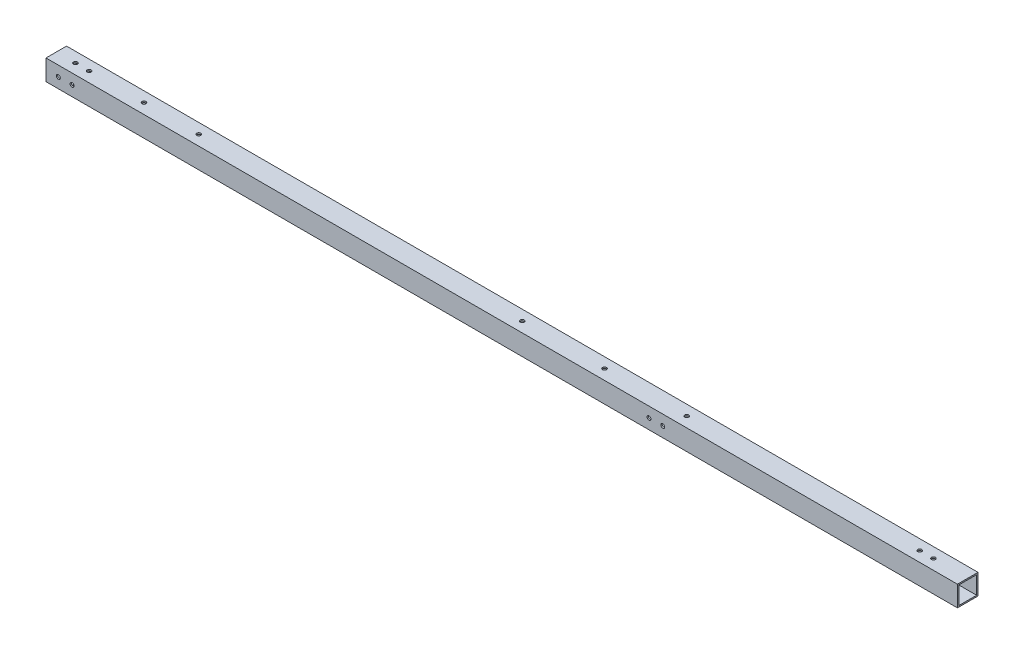
ISO-10303-21;
HEADER;
FILE_DESCRIPTION(('STEP AP214'),'2;1');
FILE_NAME('part.step','',(''),(''),'','','');
FILE_SCHEMA(('AUTOMOTIVE_DESIGN { 1 0 10303 214 1 1 1 1 }'));
ENDSEC;
DATA;
#1=APPLICATION_CONTEXT('core data for automotive mechanical design processes');
#2=APPLICATION_PROTOCOL_DEFINITION('international standard','automotive_design',2000,#1);
#3=PRODUCT_CONTEXT('',#1,'mechanical');
#4=PRODUCT('Part','Part','',(#3));
#5=PRODUCT_RELATED_PRODUCT_CATEGORY('part','',(#4));
#6=PRODUCT_DEFINITION_FORMATION('','',#4);
#7=PRODUCT_DEFINITION_CONTEXT('part definition',#1,'design');
#8=PRODUCT_DEFINITION('design','',#6,#7);
#9=PRODUCT_DEFINITION_SHAPE('','',#8);
#10=(LENGTH_UNIT() NAMED_UNIT(*) SI_UNIT(.MILLI.,.METRE.));
#11=(NAMED_UNIT(*) PLANE_ANGLE_UNIT() SI_UNIT($,.RADIAN.));
#12=(NAMED_UNIT(*) SI_UNIT($,.STERADIAN.) SOLID_ANGLE_UNIT());
#13=UNCERTAINTY_MEASURE_WITH_UNIT(LENGTH_MEASURE(1.E-05),#10,'distance_accuracy_value','');
#14=(GEOMETRIC_REPRESENTATION_CONTEXT(3) GLOBAL_UNCERTAINTY_ASSIGNED_CONTEXT((#13)) GLOBAL_UNIT_ASSIGNED_CONTEXT((#10,
#11,#12)) REPRESENTATION_CONTEXT('',''));
#15=CARTESIAN_POINT('',(0.,0.,0.));
#16=DIRECTION('',(0.,0.,1.));
#17=DIRECTION('',(1.,0.,0.));
#18=AXIS2_PLACEMENT_3D('',#15,#16,#17);
#19=CARTESIAN_POINT('',(665.,0.,0.));
#20=DIRECTION('',(-1.,0.,0.));
#21=DIRECTION('',(0.,0.,1.));
#22=AXIS2_PLACEMENT_3D('',#19,#20,#21);
#23=PLANE('',#22);
#24=DIRECTION('',(0.,1.,0.));
#25=VECTOR('',#24,1.);
#26=CARTESIAN_POINT('',(665.,-7.5,-7.5));
#27=LINE('',#26,#25);
#28=CARTESIAN_POINT('',(665.,-7.5,-7.5));
#29=VERTEX_POINT('',#28);
#30=CARTESIAN_POINT('',(665.,7.5,-7.5));
#31=VERTEX_POINT('',#30);
#32=EDGE_CURVE('E145',#29,#31,#27,.T.);
#33=ORIENTED_EDGE('',*,*,#32,.T.);
#34=DIRECTION('',(0.,0.,1.));
#35=VECTOR('',#34,1.);
#36=CARTESIAN_POINT('',(665.,7.5,7.5));
#37=LINE('',#36,#35);
#38=CARTESIAN_POINT('',(665.,7.5,7.5));
#39=VERTEX_POINT('',#38);
#40=EDGE_CURVE('E148',#31,#39,#37,.T.);
#41=ORIENTED_EDGE('',*,*,#40,.T.);
#42=DIRECTION('',(0.,-1.,0.));
#43=VECTOR('',#42,1.);
#44=CARTESIAN_POINT('',(665.,-7.5,7.5));
#45=LINE('',#44,#43);
#46=CARTESIAN_POINT('',(665.,-7.5,7.5));
#47=VERTEX_POINT('',#46);
#48=EDGE_CURVE('E151',#39,#47,#45,.T.);
#49=ORIENTED_EDGE('',*,*,#48,.T.);
#50=DIRECTION('',(0.,0.,-1.));
#51=VECTOR('',#50,1.);
#52=CARTESIAN_POINT('',(665.,-7.5,7.5));
#53=LINE('',#52,#51);
#54=EDGE_CURVE('E153',#47,#29,#53,.T.);
#55=ORIENTED_EDGE('',*,*,#54,.T.);
#56=EDGE_LOOP('',(#33,#41,#49,#55));
#57=FACE_BOUND('',#56,.T.);
#58=DIRECTION('',(0.,0.,-1.));
#59=VECTOR('',#58,1.);
#60=CARTESIAN_POINT('',(665.,-6.5,6.5));
#61=LINE('',#60,#59);
#62=CARTESIAN_POINT('',(665.,-6.5,6.5));
#63=VERTEX_POINT('',#62);
#64=CARTESIAN_POINT('',(665.,-6.5,-6.5));
#65=VERTEX_POINT('',#64);
#66=EDGE_CURVE('E107',#63,#65,#61,.T.);
#67=ORIENTED_EDGE('',*,*,#66,.F.);
#68=DIRECTION('',(0.,-1.,0.));
#69=VECTOR('',#68,1.);
#70=CARTESIAN_POINT('',(665.,-6.5,6.5));
#71=LINE('',#70,#69);
#72=CARTESIAN_POINT('',(665.,6.5,6.5));
#73=VERTEX_POINT('',#72);
#74=EDGE_CURVE('E129',#73,#63,#71,.T.);
#75=ORIENTED_EDGE('',*,*,#74,.F.);
#76=DIRECTION('',(0.,0.,1.));
#77=VECTOR('',#76,1.);
#78=CARTESIAN_POINT('',(665.,6.5,6.5));
#79=LINE('',#78,#77);
#80=CARTESIAN_POINT('',(665.,6.5,-6.5));
#81=VERTEX_POINT('',#80);
#82=EDGE_CURVE('E127',#81,#73,#79,.T.);
#83=ORIENTED_EDGE('',*,*,#82,.F.);
#84=DIRECTION('',(0.,1.,0.));
#85=VECTOR('',#84,1.);
#86=CARTESIAN_POINT('',(665.,-6.5,-6.5));
#87=LINE('',#86,#85);
#88=EDGE_CURVE('E115',#65,#81,#87,.T.);
#89=ORIENTED_EDGE('',*,*,#88,.F.);
#90=EDGE_LOOP('',(#67,#75,#83,#89));
#91=FACE_BOUND('',#90,.T.);
#92=ADVANCED_FACE('F40',(#57,#91),#23,.F.);
#93=CARTESIAN_POINT('',(0.,0.,0.));
#94=DIRECTION('',(-1.,0.,0.));
#95=DIRECTION('',(0.,0.,1.));
#96=AXIS2_PLACEMENT_3D('',#93,#94,#95);
#97=PLANE('',#96);
#98=DIRECTION('',(0.,1.,0.));
#99=VECTOR('',#98,1.);
#100=CARTESIAN_POINT('',(0.,-7.5,-7.5));
#101=LINE('',#100,#99);
#102=CARTESIAN_POINT('',(0.,-7.5,-7.5));
#103=VERTEX_POINT('',#102);
#104=CARTESIAN_POINT('',(0.,7.5,-7.5));
#105=VERTEX_POINT('',#104);
#106=EDGE_CURVE('E123',#103,#105,#101,.T.);
#107=ORIENTED_EDGE('',*,*,#106,.F.);
#108=DIRECTION('',(0.,0.,-1.));
#109=VECTOR('',#108,1.);
#110=CARTESIAN_POINT('',(0.,-7.5,7.5));
#111=LINE('',#110,#109);
#112=CARTESIAN_POINT('',(0.,-7.5,7.5));
#113=VERTEX_POINT('',#112);
#114=EDGE_CURVE('E149',#113,#103,#111,.T.);
#115=ORIENTED_EDGE('',*,*,#114,.F.);
#116=DIRECTION('',(0.,-1.,0.));
#117=VECTOR('',#116,1.);
#118=CARTESIAN_POINT('',(0.,-7.5,7.5));
#119=LINE('',#118,#117);
#120=CARTESIAN_POINT('',(0.,7.5,7.5));
#121=VERTEX_POINT('',#120);
#122=EDGE_CURVE('E160',#121,#113,#119,.T.);
#123=ORIENTED_EDGE('',*,*,#122,.F.);
#124=DIRECTION('',(0.,0.,1.));
#125=VECTOR('',#124,1.);
#126=CARTESIAN_POINT('',(0.,7.5,7.5));
#127=LINE('',#126,#125);
#128=EDGE_CURVE('E158',#105,#121,#127,.T.);
#129=ORIENTED_EDGE('',*,*,#128,.F.);
#130=EDGE_LOOP('',(#107,#115,#123,#129));
#131=FACE_BOUND('',#130,.T.);
#132=DIRECTION('',(0.,-1.,0.));
#133=VECTOR('',#132,1.);
#134=CARTESIAN_POINT('',(0.,-6.5,6.5));
#135=LINE('',#134,#133);
#136=CARTESIAN_POINT('',(0.,6.5,6.5));
#137=VERTEX_POINT('',#136);
#138=CARTESIAN_POINT('',(0.,-6.5,6.5));
#139=VERTEX_POINT('',#138);
#140=EDGE_CURVE('E116',#137,#139,#135,.T.);
#141=ORIENTED_EDGE('',*,*,#140,.T.);
#142=DIRECTION('',(0.,0.,-1.));
#143=VECTOR('',#142,1.);
#144=CARTESIAN_POINT('',(0.,-6.5,6.5));
#145=LINE('',#144,#143);
#146=CARTESIAN_POINT('',(0.,-6.5,-6.5));
#147=VERTEX_POINT('',#146);
#148=EDGE_CURVE('E65',#139,#147,#145,.T.);
#149=ORIENTED_EDGE('',*,*,#148,.T.);
#150=DIRECTION('',(0.,1.,0.));
#151=VECTOR('',#150,1.);
#152=CARTESIAN_POINT('',(0.,-6.5,-6.5));
#153=LINE('',#152,#151);
#154=CARTESIAN_POINT('',(0.,6.5,-6.5));
#155=VERTEX_POINT('',#154);
#156=EDGE_CURVE('E122',#147,#155,#153,.T.);
#157=ORIENTED_EDGE('',*,*,#156,.T.);
#158=DIRECTION('',(0.,0.,1.));
#159=VECTOR('',#158,1.);
#160=CARTESIAN_POINT('',(0.,6.5,6.5));
#161=LINE('',#160,#159);
#162=EDGE_CURVE('E137',#155,#137,#161,.T.);
#163=ORIENTED_EDGE('',*,*,#162,.T.);
#164=EDGE_LOOP('',(#141,#149,#157,#163));
#165=FACE_BOUND('',#164,.T.);
#166=ADVANCED_FACE('F287',(#131,#165),#97,.T.);
#167=CARTESIAN_POINT('',(665.,-7.5,-7.5));
#168=DIRECTION('',(0.,0.,1.));
#169=DIRECTION('',(1.,0.,0.));
#170=AXIS2_PLACEMENT_3D('',#167,#168,#169);
#171=PLANE('',#170);
#172=CARTESIAN_POINT('',(9.,0.,-7.5));
#173=DIRECTION('',(0.,0.,-1.));
#174=DIRECTION('',(-1.,0.,0.));
#175=AXIS2_PLACEMENT_3D('',#172,#173,#174);
#176=CIRCLE('',#175,1.45);
#177=CARTESIAN_POINT('',(7.55,0.,-7.5));
#178=VERTEX_POINT('',#177);
#179=EDGE_CURVE('E234',#178,#178,#176,.T.);
#180=ORIENTED_EDGE('',*,*,#179,.F.);
#181=EDGE_LOOP('',(#180));
#182=FACE_BOUND('',#181,.T.);
#183=CARTESIAN_POINT('',(19.,0.,-7.5));
#184=DIRECTION('',(0.,0.,-1.));
#185=DIRECTION('',(-1.,0.,0.));
#186=AXIS2_PLACEMENT_3D('',#183,#184,#185);
#187=CIRCLE('',#186,1.45);
#188=CARTESIAN_POINT('',(17.55,0.,-7.5));
#189=VERTEX_POINT('',#188);
#190=EDGE_CURVE('E237',#189,#189,#187,.T.);
#191=ORIENTED_EDGE('',*,*,#190,.F.);
#192=EDGE_LOOP('',(#191));
#193=FACE_BOUND('',#192,.T.);
#194=CARTESIAN_POINT('',(440.000000000001,-4.30211422042248E-13,-7.5));
#195=DIRECTION('',(0.,0.,-1.));
#196=DIRECTION('',(-1.,0.,0.));
#197=AXIS2_PLACEMENT_3D('',#194,#195,#196);
#198=CIRCLE('',#197,1.45);
#199=CARTESIAN_POINT('',(438.550000000001,-4.30211422042248E-13,-7.5));
#200=VERTEX_POINT('',#199);
#201=EDGE_CURVE('E243',#200,#200,#198,.T.);
#202=ORIENTED_EDGE('',*,*,#201,.F.);
#203=EDGE_LOOP('',(#202));
#204=FACE_BOUND('',#203,.T.);
#205=CARTESIAN_POINT('',(450.000000000001,-2.08166817117217E-13,-7.5));
#206=DIRECTION('',(0.,0.,-1.));
#207=DIRECTION('',(-1.,0.,0.));
#208=AXIS2_PLACEMENT_3D('',#205,#206,#207);
#209=CIRCLE('',#208,1.45);
#210=CARTESIAN_POINT('',(448.550000000001,-2.08166817117217E-13,-7.5));
#211=VERTEX_POINT('',#210);
#212=EDGE_CURVE('E249',#211,#211,#209,.T.);
#213=ORIENTED_EDGE('',*,*,#212,.F.);
#214=EDGE_LOOP('',(#213));
#215=FACE_BOUND('',#214,.T.);
#216=ORIENTED_EDGE('',*,*,#106,.T.);
#217=DIRECTION('',(-1.,0.,0.));
#218=VECTOR('',#217,1.);
#219=CARTESIAN_POINT('',(665.,7.5,-7.5));
#220=LINE('',#219,#218);
#221=EDGE_CURVE('E11',#31,#105,#220,.T.);
#222=ORIENTED_EDGE('',*,*,#221,.F.);
#223=ORIENTED_EDGE('',*,*,#32,.F.);
#224=DIRECTION('',(-1.,0.,0.));
#225=VECTOR('',#224,1.);
#226=CARTESIAN_POINT('',(665.,-7.5,-7.5));
#227=LINE('',#226,#225);
#228=EDGE_CURVE('E155',#29,#103,#227,.T.);
#229=ORIENTED_EDGE('',*,*,#228,.T.);
#230=EDGE_LOOP('',(#216,#222,#223,#229));
#231=FACE_BOUND('',#230,.T.);
#232=ADVANCED_FACE('F42',(#182,#193,#204,#215,#231),#171,.F.);
#233=CARTESIAN_POINT('',(665.,7.5,7.5));
#234=DIRECTION('',(0.,-1.,0.));
#235=DIRECTION('',(0.,0.,-1.));
#236=AXIS2_PLACEMENT_3D('',#233,#234,#235);
#237=PLANE('',#236);
#238=CARTESIAN_POINT('',(64.,7.5,0.));
#239=DIRECTION('',(0.,1.,0.));
#240=DIRECTION('',(0.,0.,1.));
#241=AXIS2_PLACEMENT_3D('',#238,#239,#240);
#242=CIRCLE('',#241,1.45);
#243=CARTESIAN_POINT('',(64.,7.5,1.45000000000002));
#244=VERTEX_POINT('',#243);
#245=EDGE_CURVE('E441',#244,#244,#242,.T.);
#246=ORIENTED_EDGE('',*,*,#245,.F.);
#247=EDGE_LOOP('',(#246));
#248=FACE_BOUND('',#247,.T.);
#249=CARTESIAN_POINT('',(24.,7.5,0.));
#250=DIRECTION('',(0.,1.,0.));
#251=DIRECTION('',(0.,0.,1.));
#252=AXIS2_PLACEMENT_3D('',#249,#250,#251);
#253=CIRCLE('',#252,1.45);
#254=CARTESIAN_POINT('',(24.,7.5,1.45000000000002));
#255=VERTEX_POINT('',#254);
#256=EDGE_CURVE('E434',#255,#255,#253,.T.);
#257=ORIENTED_EDGE('',*,*,#256,.F.);
#258=EDGE_LOOP('',(#257));
#259=FACE_BOUND('',#258,.T.);
#260=CARTESIAN_POINT('',(14.,7.5,0.));
#261=DIRECTION('',(0.,1.,0.));
#262=DIRECTION('',(0.,0.,1.));
#263=AXIS2_PLACEMENT_3D('',#260,#261,#262);
#264=CIRCLE('',#263,1.45);
#265=CARTESIAN_POINT('',(14.,7.5,1.45000000000002));
#266=VERTEX_POINT('',#265);
#267=EDGE_CURVE('E453',#266,#266,#264,.T.);
#268=ORIENTED_EDGE('',*,*,#267,.F.);
#269=EDGE_LOOP('',(#268));
#270=FACE_BOUND('',#269,.T.);
#271=CARTESIAN_POINT('',(640.,7.5,0.));
#272=DIRECTION('',(0.,1.,0.));
#273=DIRECTION('',(0.,0.,1.));
#274=AXIS2_PLACEMENT_3D('',#271,#272,#273);
#275=CIRCLE('',#274,1.44999999999994);
#276=CARTESIAN_POINT('',(640.,7.5,1.44999999999996));
#277=VERTEX_POINT('',#276);
#278=EDGE_CURVE('E446',#277,#277,#275,.T.);
#279=ORIENTED_EDGE('',*,*,#278,.F.);
#280=EDGE_LOOP('',(#279));
#281=FACE_BOUND('',#280,.T.);
#282=CARTESIAN_POINT('',(104.,7.5,0.));
#283=DIRECTION('',(0.,1.,0.));
#284=DIRECTION('',(0.,0.,1.));
#285=AXIS2_PLACEMENT_3D('',#282,#283,#284);
#286=CIRCLE('',#285,1.45);
#287=CARTESIAN_POINT('',(104.,7.5,1.45000000000002));
#288=VERTEX_POINT('',#287);
#289=EDGE_CURVE('E410',#288,#288,#286,.T.);
#290=ORIENTED_EDGE('',*,*,#289,.F.);
#291=EDGE_LOOP('',(#290));
#292=FACE_BOUND('',#291,.T.);
#293=CARTESIAN_POINT('',(340.,7.5,9.71445146547012E-13));
#294=DIRECTION('',(0.,1.,0.));
#295=DIRECTION('',(0.,0.,1.));
#296=AXIS2_PLACEMENT_3D('',#293,#294,#295);
#297=CIRCLE('',#296,1.45);
#298=CARTESIAN_POINT('',(340.,7.5,1.45000000000097));
#299=VERTEX_POINT('',#298);
#300=EDGE_CURVE('E411',#299,#299,#297,.T.);
#301=ORIENTED_EDGE('',*,*,#300,.F.);
#302=EDGE_LOOP('',(#301));
#303=FACE_BOUND('',#302,.T.);
#304=CARTESIAN_POINT('',(400.,7.5,9.61036805691151E-13));
#305=DIRECTION('',(0.,1.,0.));
#306=DIRECTION('',(0.,0.,1.));
#307=AXIS2_PLACEMENT_3D('',#304,#305,#306);
#308=CIRCLE('',#307,1.45);
#309=CARTESIAN_POINT('',(400.,7.5,1.45000000000096));
#310=VERTEX_POINT('',#309);
#311=EDGE_CURVE('E422',#310,#310,#308,.T.);
#312=ORIENTED_EDGE('',*,*,#311,.F.);
#313=EDGE_LOOP('',(#312));
#314=FACE_BOUND('',#313,.T.);
#315=CARTESIAN_POINT('',(460.,7.5,9.61036805691151E-13));
#316=DIRECTION('',(0.,1.,0.));
#317=DIRECTION('',(0.,0.,1.));
#318=AXIS2_PLACEMENT_3D('',#315,#316,#317);
#319=CIRCLE('',#318,1.45);
#320=CARTESIAN_POINT('',(460.,7.5,1.45000000000096));
#321=VERTEX_POINT('',#320);
#322=EDGE_CURVE('E428',#321,#321,#319,.T.);
#323=ORIENTED_EDGE('',*,*,#322,.F.);
#324=EDGE_LOOP('',(#323));
#325=FACE_BOUND('',#324,.T.);
#326=CARTESIAN_POINT('',(630.,7.5,0.));
#327=DIRECTION('',(0.,1.,0.));
#328=DIRECTION('',(0.,0.,1.));
#329=AXIS2_PLACEMENT_3D('',#326,#327,#328);
#330=CIRCLE('',#329,1.44999999999994);
#331=CARTESIAN_POINT('',(630.,7.5,1.44999999999996));
#332=VERTEX_POINT('',#331);
#333=EDGE_CURVE('E449',#332,#332,#330,.T.);
#334=ORIENTED_EDGE('',*,*,#333,.F.);
#335=EDGE_LOOP('',(#334));
#336=FACE_BOUND('',#335,.T.);
#337=ORIENTED_EDGE('',*,*,#128,.T.);
#338=DIRECTION('',(-1.,0.,0.));
#339=VECTOR('',#338,1.);
#340=CARTESIAN_POINT('',(665.,7.5,7.5));
#341=LINE('',#340,#339);
#342=EDGE_CURVE('E49',#39,#121,#341,.T.);
#343=ORIENTED_EDGE('',*,*,#342,.F.);
#344=ORIENTED_EDGE('',*,*,#40,.F.);
#345=ORIENTED_EDGE('',*,*,#221,.T.);
#346=EDGE_LOOP('',(#337,#343,#344,#345));
#347=FACE_BOUND('',#346,.T.);
#348=ADVANCED_FACE('F286',(#248,#259,#270,#281,#292,#303,#314,#325,#336,#347),#237,.F.);
#349=CARTESIAN_POINT('',(665.,-7.5,7.5));
#350=DIRECTION('',(0.,0.,-1.));
#351=DIRECTION('',(-1.,0.,0.));
#352=AXIS2_PLACEMENT_3D('',#349,#350,#351);
#353=PLANE('',#352);
#354=CARTESIAN_POINT('',(9.,0.,7.5));
#355=DIRECTION('',(0.,0.,-1.));
#356=DIRECTION('',(-1.,0.,0.));
#357=AXIS2_PLACEMENT_3D('',#354,#355,#356);
#358=CIRCLE('',#357,1.45);
#359=CARTESIAN_POINT('',(7.55,0.,7.5));
#360=VERTEX_POINT('',#359);
#361=EDGE_CURVE('E174',#360,#360,#358,.T.);
#362=ORIENTED_EDGE('',*,*,#361,.T.);
#363=EDGE_LOOP('',(#362));
#364=FACE_BOUND('',#363,.T.);
#365=CARTESIAN_POINT('',(19.,0.,7.5));
#366=DIRECTION('',(0.,0.,-1.));
#367=DIRECTION('',(-1.,0.,0.));
#368=AXIS2_PLACEMENT_3D('',#365,#366,#367);
#369=CIRCLE('',#368,1.45);
#370=CARTESIAN_POINT('',(17.55,0.,7.5));
#371=VERTEX_POINT('',#370);
#372=EDGE_CURVE('E240',#371,#371,#369,.T.);
#373=ORIENTED_EDGE('',*,*,#372,.T.);
#374=EDGE_LOOP('',(#373));
#375=FACE_BOUND('',#374,.T.);
#376=CARTESIAN_POINT('',(440.000000000001,-4.30211422042248E-13,7.5));
#377=DIRECTION('',(0.,0.,-1.));
#378=DIRECTION('',(-1.,0.,0.));
#379=AXIS2_PLACEMENT_3D('',#376,#377,#378);
#380=CIRCLE('',#379,1.45);
#381=CARTESIAN_POINT('',(438.550000000001,-4.30211422042248E-13,7.5));
#382=VERTEX_POINT('',#381);
#383=EDGE_CURVE('E246',#382,#382,#380,.T.);
#384=ORIENTED_EDGE('',*,*,#383,.T.);
#385=EDGE_LOOP('',(#384));
#386=FACE_BOUND('',#385,.T.);
#387=CARTESIAN_POINT('',(450.000000000001,-2.08166817117217E-13,7.5));
#388=DIRECTION('',(0.,0.,-1.));
#389=DIRECTION('',(-1.,0.,0.));
#390=AXIS2_PLACEMENT_3D('',#387,#388,#389);
#391=CIRCLE('',#390,1.45);
#392=CARTESIAN_POINT('',(448.550000000001,-2.08166817117217E-13,7.5));
#393=VERTEX_POINT('',#392);
#394=EDGE_CURVE('E231',#393,#393,#391,.T.);
#395=ORIENTED_EDGE('',*,*,#394,.T.);
#396=EDGE_LOOP('',(#395));
#397=FACE_BOUND('',#396,.T.);
#398=ORIENTED_EDGE('',*,*,#122,.T.);
#399=DIRECTION('',(-1.,0.,0.));
#400=VECTOR('',#399,1.);
#401=CARTESIAN_POINT('',(665.,-7.5,7.5));
#402=LINE('',#401,#400);
#403=EDGE_CURVE('E165',#47,#113,#402,.T.);
#404=ORIENTED_EDGE('',*,*,#403,.F.);
#405=ORIENTED_EDGE('',*,*,#48,.F.);
#406=ORIENTED_EDGE('',*,*,#342,.T.);
#407=EDGE_LOOP('',(#398,#404,#405,#406));
#408=FACE_BOUND('',#407,.T.);
#409=ADVANCED_FACE('F306',(#364,#375,#386,#397,#408),#353,.F.);
#410=CARTESIAN_POINT('',(665.,-7.5,7.5));
#411=DIRECTION('',(0.,1.,0.));
#412=DIRECTION('',(0.,0.,1.));
#413=AXIS2_PLACEMENT_3D('',#410,#411,#412);
#414=PLANE('',#413);
#415=CARTESIAN_POINT('',(64.,-7.5,0.));
#416=DIRECTION('',(0.,1.,0.));
#417=DIRECTION('',(0.,0.,1.));
#418=AXIS2_PLACEMENT_3D('',#415,#416,#417);
#419=CIRCLE('',#418,1.45);
#420=CARTESIAN_POINT('',(64.,-7.5,1.45000000000002));
#421=VERTEX_POINT('',#420);
#422=EDGE_CURVE('E414',#421,#421,#419,.T.);
#423=ORIENTED_EDGE('',*,*,#422,.T.);
#424=EDGE_LOOP('',(#423));
#425=FACE_BOUND('',#424,.T.);
#426=CARTESIAN_POINT('',(24.,-7.5,0.));
#427=DIRECTION('',(0.,1.,0.));
#428=DIRECTION('',(0.,0.,1.));
#429=AXIS2_PLACEMENT_3D('',#426,#427,#428);
#430=CIRCLE('',#429,1.45);
#431=CARTESIAN_POINT('',(24.,-7.5,1.45000000000002));
#432=VERTEX_POINT('',#431);
#433=EDGE_CURVE('E438',#432,#432,#430,.T.);
#434=ORIENTED_EDGE('',*,*,#433,.T.);
#435=EDGE_LOOP('',(#434));
#436=FACE_BOUND('',#435,.T.);
#437=CARTESIAN_POINT('',(14.,-7.5,0.));
#438=DIRECTION('',(0.,1.,0.));
#439=DIRECTION('',(0.,0.,1.));
#440=AXIS2_PLACEMENT_3D('',#437,#438,#439);
#441=CIRCLE('',#440,1.45);
#442=CARTESIAN_POINT('',(14.,-7.5,1.45000000000002));
#443=VERTEX_POINT('',#442);
#444=EDGE_CURVE('E437',#443,#443,#441,.T.);
#445=ORIENTED_EDGE('',*,*,#444,.T.);
#446=EDGE_LOOP('',(#445));
#447=FACE_BOUND('',#446,.T.);
#448=CARTESIAN_POINT('',(640.,-7.5,0.));
#449=DIRECTION('',(0.,1.,0.));
#450=DIRECTION('',(0.,0.,1.));
#451=AXIS2_PLACEMENT_3D('',#448,#449,#450);
#452=CIRCLE('',#451,1.44999999999994);
#453=CARTESIAN_POINT('',(640.,-7.5,1.44999999999996));
#454=VERTEX_POINT('',#453);
#455=EDGE_CURVE('E450',#454,#454,#452,.T.);
#456=ORIENTED_EDGE('',*,*,#455,.T.);
#457=EDGE_LOOP('',(#456));
#458=FACE_BOUND('',#457,.T.);
#459=CARTESIAN_POINT('',(104.,-7.5,0.));
#460=DIRECTION('',(0.,1.,0.));
#461=DIRECTION('',(0.,0.,1.));
#462=AXIS2_PLACEMENT_3D('',#459,#460,#461);
#463=CIRCLE('',#462,1.45);
#464=CARTESIAN_POINT('',(104.,-7.5,1.45000000000002));
#465=VERTEX_POINT('',#464);
#466=EDGE_CURVE('E408',#465,#465,#463,.T.);
#467=ORIENTED_EDGE('',*,*,#466,.T.);
#468=EDGE_LOOP('',(#467));
#469=FACE_BOUND('',#468,.T.);
#470=CARTESIAN_POINT('',(340.,-7.5,9.71445146547012E-13));
#471=DIRECTION('',(0.,1.,0.));
#472=DIRECTION('',(0.,0.,1.));
#473=AXIS2_PLACEMENT_3D('',#470,#471,#472);
#474=CIRCLE('',#473,1.45);
#475=CARTESIAN_POINT('',(340.,-7.5,1.45000000000097));
#476=VERTEX_POINT('',#475);
#477=EDGE_CURVE('E417',#476,#476,#474,.T.);
#478=ORIENTED_EDGE('',*,*,#477,.T.);
#479=EDGE_LOOP('',(#478));
#480=FACE_BOUND('',#479,.T.);
#481=CARTESIAN_POINT('',(400.,-7.5,9.61036805691151E-13));
#482=DIRECTION('',(0.,1.,0.));
#483=DIRECTION('',(0.,0.,1.));
#484=AXIS2_PLACEMENT_3D('',#481,#482,#483);
#485=CIRCLE('',#484,1.45);
#486=CARTESIAN_POINT('',(400.,-7.5,1.45000000000096));
#487=VERTEX_POINT('',#486);
#488=EDGE_CURVE('E425',#487,#487,#485,.T.);
#489=ORIENTED_EDGE('',*,*,#488,.T.);
#490=EDGE_LOOP('',(#489));
#491=FACE_BOUND('',#490,.T.);
#492=CARTESIAN_POINT('',(460.,-7.5,9.61036805691151E-13));
#493=DIRECTION('',(0.,1.,0.));
#494=DIRECTION('',(0.,0.,1.));
#495=AXIS2_PLACEMENT_3D('',#492,#493,#494);
#496=CIRCLE('',#495,1.45);
#497=CARTESIAN_POINT('',(460.,-7.5,1.45000000000096));
#498=VERTEX_POINT('',#497);
#499=EDGE_CURVE('E431',#498,#498,#496,.T.);
#500=ORIENTED_EDGE('',*,*,#499,.T.);
#501=EDGE_LOOP('',(#500));
#502=FACE_BOUND('',#501,.T.);
#503=CARTESIAN_POINT('',(630.,-7.5,0.));
#504=DIRECTION('',(0.,1.,0.));
#505=DIRECTION('',(0.,0.,1.));
#506=AXIS2_PLACEMENT_3D('',#503,#504,#505);
#507=CIRCLE('',#506,1.44999999999994);
#508=CARTESIAN_POINT('',(630.,-7.5,1.44999999999996));
#509=VERTEX_POINT('',#508);
#510=EDGE_CURVE('E190',#509,#509,#507,.T.);
#511=ORIENTED_EDGE('',*,*,#510,.T.);
#512=EDGE_LOOP('',(#511));
#513=FACE_BOUND('',#512,.T.);
#514=ORIENTED_EDGE('',*,*,#114,.T.);
#515=ORIENTED_EDGE('',*,*,#228,.F.);
#516=ORIENTED_EDGE('',*,*,#54,.F.);
#517=ORIENTED_EDGE('',*,*,#403,.T.);
#518=EDGE_LOOP('',(#514,#515,#516,#517));
#519=FACE_BOUND('',#518,.T.);
#520=ADVANCED_FACE('F304',(#425,#436,#447,#458,#469,#480,#491,#502,#513,#519),#414,.F.);
#521=CARTESIAN_POINT('',(665.,-6.5,6.5));
#522=DIRECTION('',(0.,1.,0.));
#523=DIRECTION('',(0.,0.,1.));
#524=AXIS2_PLACEMENT_3D('',#521,#522,#523);
#525=PLANE('',#524);
#526=CARTESIAN_POINT('',(64.,-6.5,0.));
#527=DIRECTION('',(0.,1.,0.));
#528=DIRECTION('',(0.,0.,1.));
#529=AXIS2_PLACEMENT_3D('',#526,#527,#528);
#530=CIRCLE('',#529,1.45);
#531=CARTESIAN_POINT('',(64.,-6.5,1.45000000000002));
#532=VERTEX_POINT('',#531);
#533=EDGE_CURVE('E228',#532,#532,#530,.T.);
#534=ORIENTED_EDGE('',*,*,#533,.F.);
#535=EDGE_LOOP('',(#534));
#536=FACE_BOUND('',#535,.T.);
#537=CARTESIAN_POINT('',(24.,-6.5,0.));
#538=DIRECTION('',(0.,1.,0.));
#539=DIRECTION('',(0.,0.,1.));
#540=AXIS2_PLACEMENT_3D('',#537,#538,#539);
#541=CIRCLE('',#540,1.45);
#542=CARTESIAN_POINT('',(24.,-6.5,1.45000000000002));
#543=VERTEX_POINT('',#542);
#544=EDGE_CURVE('E216',#543,#543,#541,.T.);
#545=ORIENTED_EDGE('',*,*,#544,.F.);
#546=EDGE_LOOP('',(#545));
#547=FACE_BOUND('',#546,.T.);
#548=CARTESIAN_POINT('',(14.,-6.5,0.));
#549=DIRECTION('',(0.,1.,0.));
#550=DIRECTION('',(0.,0.,1.));
#551=AXIS2_PLACEMENT_3D('',#548,#549,#550);
#552=CIRCLE('',#551,1.45);
#553=CARTESIAN_POINT('',(14.,-6.5,1.45000000000002));
#554=VERTEX_POINT('',#553);
#555=EDGE_CURVE('E213',#554,#554,#552,.T.);
#556=ORIENTED_EDGE('',*,*,#555,.F.);
#557=EDGE_LOOP('',(#556));
#558=FACE_BOUND('',#557,.T.);
#559=CARTESIAN_POINT('',(640.,-6.5,0.));
#560=DIRECTION('',(0.,1.,0.));
#561=DIRECTION('',(0.,0.,1.));
#562=AXIS2_PLACEMENT_3D('',#559,#560,#561);
#563=CIRCLE('',#562,1.44999999999994);
#564=CARTESIAN_POINT('',(640.,-6.5,1.44999999999996));
#565=VERTEX_POINT('',#564);
#566=EDGE_CURVE('E210',#565,#565,#563,.T.);
#567=ORIENTED_EDGE('',*,*,#566,.F.);
#568=EDGE_LOOP('',(#567));
#569=FACE_BOUND('',#568,.T.);
#570=CARTESIAN_POINT('',(104.,-6.5,0.));
#571=DIRECTION('',(0.,1.,0.));
#572=DIRECTION('',(0.,0.,1.));
#573=AXIS2_PLACEMENT_3D('',#570,#571,#572);
#574=CIRCLE('',#573,1.45);
#575=CARTESIAN_POINT('',(104.,-6.5,1.45000000000002));
#576=VERTEX_POINT('',#575);
#577=EDGE_CURVE('E206',#576,#576,#574,.T.);
#578=ORIENTED_EDGE('',*,*,#577,.F.);
#579=EDGE_LOOP('',(#578));
#580=FACE_BOUND('',#579,.T.);
#581=CARTESIAN_POINT('',(340.,-6.5,9.71445146547012E-13));
#582=DIRECTION('',(0.,1.,0.));
#583=DIRECTION('',(0.,0.,1.));
#584=AXIS2_PLACEMENT_3D('',#581,#582,#583);
#585=CIRCLE('',#584,1.45);
#586=CARTESIAN_POINT('',(340.,-6.5,1.45000000000097));
#587=VERTEX_POINT('',#586);
#588=EDGE_CURVE('E202',#587,#587,#585,.T.);
#589=ORIENTED_EDGE('',*,*,#588,.F.);
#590=EDGE_LOOP('',(#589));
#591=FACE_BOUND('',#590,.T.);
#592=CARTESIAN_POINT('',(400.,-6.5,9.61036805691151E-13));
#593=DIRECTION('',(0.,1.,0.));
#594=DIRECTION('',(0.,0.,1.));
#595=AXIS2_PLACEMENT_3D('',#592,#593,#594);
#596=CIRCLE('',#595,1.45);
#597=CARTESIAN_POINT('',(400.,-6.5,1.45000000000096));
#598=VERTEX_POINT('',#597);
#599=EDGE_CURVE('E198',#598,#598,#596,.T.);
#600=ORIENTED_EDGE('',*,*,#599,.F.);
#601=EDGE_LOOP('',(#600));
#602=FACE_BOUND('',#601,.T.);
#603=CARTESIAN_POINT('',(460.,-6.5,9.61036805691151E-13));
#604=DIRECTION('',(0.,1.,0.));
#605=DIRECTION('',(0.,0.,1.));
#606=AXIS2_PLACEMENT_3D('',#603,#604,#605);
#607=CIRCLE('',#606,1.45);
#608=CARTESIAN_POINT('',(460.,-6.5,1.45000000000096));
#609=VERTEX_POINT('',#608);
#610=EDGE_CURVE('E194',#609,#609,#607,.T.);
#611=ORIENTED_EDGE('',*,*,#610,.F.);
#612=EDGE_LOOP('',(#611));
#613=FACE_BOUND('',#612,.T.);
#614=CARTESIAN_POINT('',(630.,-6.5,0.));
#615=DIRECTION('',(0.,1.,0.));
#616=DIRECTION('',(0.,0.,1.));
#617=AXIS2_PLACEMENT_3D('',#614,#615,#616);
#618=CIRCLE('',#617,1.44999999999994);
#619=CARTESIAN_POINT('',(630.,-6.5,1.44999999999996));
#620=VERTEX_POINT('',#619);
#621=EDGE_CURVE('E189',#620,#620,#618,.T.);
#622=ORIENTED_EDGE('',*,*,#621,.F.);
#623=EDGE_LOOP('',(#622));
#624=FACE_BOUND('',#623,.T.);
#625=ORIENTED_EDGE('',*,*,#148,.F.);
#626=DIRECTION('',(-1.,0.,0.));
#627=VECTOR('',#626,1.);
#628=CARTESIAN_POINT('',(665.,-6.5,6.5));
#629=LINE('',#628,#627);
#630=EDGE_CURVE('E111',#63,#139,#629,.T.);
#631=ORIENTED_EDGE('',*,*,#630,.F.);
#632=ORIENTED_EDGE('',*,*,#66,.T.);
#633=DIRECTION('',(-1.,0.,0.));
#634=VECTOR('',#633,1.);
#635=CARTESIAN_POINT('',(665.,-6.5,-6.5));
#636=LINE('',#635,#634);
#637=EDGE_CURVE('E110',#65,#147,#636,.T.);
#638=ORIENTED_EDGE('',*,*,#637,.T.);
#639=EDGE_LOOP('',(#625,#631,#632,#638));
#640=FACE_BOUND('',#639,.T.);
#641=ADVANCED_FACE('F109',(#536,#547,#558,#569,#580,#591,#602,#613,#624,#640),#525,.T.);
#642=CARTESIAN_POINT('',(665.,-6.5,-6.5));
#643=DIRECTION('',(0.,0.,1.));
#644=DIRECTION('',(0.,-1.,0.));
#645=AXIS2_PLACEMENT_3D('',#642,#643,#644);
#646=PLANE('',#645);
#647=CARTESIAN_POINT('',(9.,0.,-6.5));
#648=DIRECTION('',(0.,0.,1.));
#649=DIRECTION('',(0.,-1.,0.));
#650=AXIS2_PLACEMENT_3D('',#647,#648,#649);
#651=CIRCLE('',#650,1.45);
#652=CARTESIAN_POINT('',(9.,-1.45,-6.5));
#653=VERTEX_POINT('',#652);
#654=EDGE_CURVE('E135',#653,#653,#651,.T.);
#655=ORIENTED_EDGE('',*,*,#654,.F.);
#656=EDGE_LOOP('',(#655));
#657=FACE_BOUND('',#656,.T.);
#658=CARTESIAN_POINT('',(19.,0.,-6.5));
#659=DIRECTION('',(0.,0.,1.));
#660=DIRECTION('',(0.,-1.,0.));
#661=AXIS2_PLACEMENT_3D('',#658,#659,#660);
#662=CIRCLE('',#661,1.45);
#663=CARTESIAN_POINT('',(19.,-1.44999999999999,-6.5));
#664=VERTEX_POINT('',#663);
#665=EDGE_CURVE('E182',#664,#664,#662,.T.);
#666=ORIENTED_EDGE('',*,*,#665,.F.);
#667=EDGE_LOOP('',(#666));
#668=FACE_BOUND('',#667,.T.);
#669=CARTESIAN_POINT('',(440.000000000001,-4.30211422042248E-13,-6.5));
#670=DIRECTION('',(0.,0.,1.));
#671=DIRECTION('',(0.,-1.,0.));
#672=AXIS2_PLACEMENT_3D('',#669,#670,#671);
#673=CIRCLE('',#672,1.45);
#674=CARTESIAN_POINT('',(440.000000000001,-1.45000000000043,-6.5));
#675=VERTEX_POINT('',#674);
#676=EDGE_CURVE('E178',#675,#675,#673,.T.);
#677=ORIENTED_EDGE('',*,*,#676,.F.);
#678=EDGE_LOOP('',(#677));
#679=FACE_BOUND('',#678,.T.);
#680=CARTESIAN_POINT('',(450.000000000001,-2.08166817117217E-13,-6.5));
#681=DIRECTION('',(0.,0.,1.));
#682=DIRECTION('',(0.,-1.,0.));
#683=AXIS2_PLACEMENT_3D('',#680,#681,#682);
#684=CIRCLE('',#683,1.45);
#685=CARTESIAN_POINT('',(450.000000000001,-1.45000000000021,-6.5));
#686=VERTEX_POINT('',#685);
#687=EDGE_CURVE('E173',#686,#686,#684,.T.);
#688=ORIENTED_EDGE('',*,*,#687,.F.);
#689=EDGE_LOOP('',(#688));
#690=FACE_BOUND('',#689,.T.);
#691=ORIENTED_EDGE('',*,*,#156,.F.);
#692=ORIENTED_EDGE('',*,*,#637,.F.);
#693=ORIENTED_EDGE('',*,*,#88,.T.);
#694=DIRECTION('',(-1.,0.,0.));
#695=VECTOR('',#694,1.);
#696=CARTESIAN_POINT('',(665.,6.5,-6.5));
#697=LINE('',#696,#695);
#698=EDGE_CURVE('E124',#81,#155,#697,.T.);
#699=ORIENTED_EDGE('',*,*,#698,.T.);
#700=EDGE_LOOP('',(#691,#692,#693,#699));
#701=FACE_BOUND('',#700,.T.);
#702=ADVANCED_FACE('F119',(#657,#668,#679,#690,#701),#646,.T.);
#703=CARTESIAN_POINT('',(665.,6.5,6.5));
#704=DIRECTION('',(0.,-1.,0.));
#705=DIRECTION('',(0.,0.,-1.));
#706=AXIS2_PLACEMENT_3D('',#703,#704,#705);
#707=PLANE('',#706);
#708=CARTESIAN_POINT('',(64.,6.5,0.));
#709=DIRECTION('',(0.,-1.,0.));
#710=DIRECTION('',(0.,0.,-1.));
#711=AXIS2_PLACEMENT_3D('',#708,#709,#710);
#712=CIRCLE('',#711,1.45);
#713=CARTESIAN_POINT('',(64.,6.5,-1.44999999999998));
#714=VERTEX_POINT('',#713);
#715=EDGE_CURVE('E44',#714,#714,#712,.T.);
#716=ORIENTED_EDGE('',*,*,#715,.F.);
#717=EDGE_LOOP('',(#716));
#718=FACE_BOUND('',#717,.T.);
#719=CARTESIAN_POINT('',(24.,6.5,0.));
#720=DIRECTION('',(0.,-1.,0.));
#721=DIRECTION('',(0.,0.,-1.));
#722=AXIS2_PLACEMENT_3D('',#719,#720,#721);
#723=CIRCLE('',#722,1.45);
#724=CARTESIAN_POINT('',(24.,6.5,-1.44999999999998));
#725=VERTEX_POINT('',#724);
#726=EDGE_CURVE('E214',#725,#725,#723,.T.);
#727=ORIENTED_EDGE('',*,*,#726,.F.);
#728=EDGE_LOOP('',(#727));
#729=FACE_BOUND('',#728,.T.);
#730=CARTESIAN_POINT('',(14.,6.5,0.));
#731=DIRECTION('',(0.,-1.,0.));
#732=DIRECTION('',(0.,0.,-1.));
#733=AXIS2_PLACEMENT_3D('',#730,#731,#732);
#734=CIRCLE('',#733,1.45);
#735=CARTESIAN_POINT('',(14.,6.5,-1.44999999999998));
#736=VERTEX_POINT('',#735);
#737=EDGE_CURVE('E211',#736,#736,#734,.T.);
#738=ORIENTED_EDGE('',*,*,#737,.F.);
#739=EDGE_LOOP('',(#738));
#740=FACE_BOUND('',#739,.T.);
#741=CARTESIAN_POINT('',(640.,6.5,0.));
#742=DIRECTION('',(0.,-1.,0.));
#743=DIRECTION('',(0.,0.,-1.));
#744=AXIS2_PLACEMENT_3D('',#741,#742,#743);
#745=CIRCLE('',#744,1.44999999999994);
#746=CARTESIAN_POINT('',(640.,6.5,-1.44999999999992));
#747=VERTEX_POINT('',#746);
#748=EDGE_CURVE('E207',#747,#747,#745,.T.);
#749=ORIENTED_EDGE('',*,*,#748,.F.);
#750=EDGE_LOOP('',(#749));
#751=FACE_BOUND('',#750,.T.);
#752=CARTESIAN_POINT('',(104.,6.5,0.));
#753=DIRECTION('',(0.,-1.,0.));
#754=DIRECTION('',(0.,0.,-1.));
#755=AXIS2_PLACEMENT_3D('',#752,#753,#754);
#756=CIRCLE('',#755,1.45);
#757=CARTESIAN_POINT('',(104.,6.5,-1.44999999999998));
#758=VERTEX_POINT('',#757);
#759=EDGE_CURVE('E203',#758,#758,#756,.T.);
#760=ORIENTED_EDGE('',*,*,#759,.F.);
#761=EDGE_LOOP('',(#760));
#762=FACE_BOUND('',#761,.T.);
#763=CARTESIAN_POINT('',(340.,6.5,9.71445146547012E-13));
#764=DIRECTION('',(0.,-1.,0.));
#765=DIRECTION('',(0.,0.,-1.));
#766=AXIS2_PLACEMENT_3D('',#763,#764,#765);
#767=CIRCLE('',#766,1.45);
#768=CARTESIAN_POINT('',(340.,6.5,-1.44999999999903));
#769=VERTEX_POINT('',#768);
#770=EDGE_CURVE('E199',#769,#769,#767,.T.);
#771=ORIENTED_EDGE('',*,*,#770,.F.);
#772=EDGE_LOOP('',(#771));
#773=FACE_BOUND('',#772,.T.);
#774=CARTESIAN_POINT('',(400.,6.5,9.61036805691151E-13));
#775=DIRECTION('',(0.,-1.,0.));
#776=DIRECTION('',(0.,0.,-1.));
#777=AXIS2_PLACEMENT_3D('',#774,#775,#776);
#778=CIRCLE('',#777,1.45);
#779=CARTESIAN_POINT('',(400.,6.5,-1.44999999999904));
#780=VERTEX_POINT('',#779);
#781=EDGE_CURVE('E195',#780,#780,#778,.T.);
#782=ORIENTED_EDGE('',*,*,#781,.F.);
#783=EDGE_LOOP('',(#782));
#784=FACE_BOUND('',#783,.T.);
#785=CARTESIAN_POINT('',(460.,6.5,9.61036805691151E-13));
#786=DIRECTION('',(0.,-1.,0.));
#787=DIRECTION('',(0.,0.,-1.));
#788=AXIS2_PLACEMENT_3D('',#785,#786,#787);
#789=CIRCLE('',#788,1.45);
#790=CARTESIAN_POINT('',(460.,6.5,-1.44999999999904));
#791=VERTEX_POINT('',#790);
#792=EDGE_CURVE('E191',#791,#791,#789,.T.);
#793=ORIENTED_EDGE('',*,*,#792,.F.);
#794=EDGE_LOOP('',(#793));
#795=FACE_BOUND('',#794,.T.);
#796=CARTESIAN_POINT('',(630.,6.5,0.));
#797=DIRECTION('',(0.,-1.,0.));
#798=DIRECTION('',(0.,0.,-1.));
#799=AXIS2_PLACEMENT_3D('',#796,#797,#798);
#800=CIRCLE('',#799,1.44999999999994);
#801=CARTESIAN_POINT('',(630.,6.5,-1.44999999999993));
#802=VERTEX_POINT('',#801);
#803=EDGE_CURVE('E186',#802,#802,#800,.T.);
#804=ORIENTED_EDGE('',*,*,#803,.F.);
#805=EDGE_LOOP('',(#804));
#806=FACE_BOUND('',#805,.T.);
#807=ORIENTED_EDGE('',*,*,#162,.F.);
#808=ORIENTED_EDGE('',*,*,#698,.F.);
#809=ORIENTED_EDGE('',*,*,#82,.T.);
#810=DIRECTION('',(-1.,0.,0.));
#811=VECTOR('',#810,1.);
#812=CARTESIAN_POINT('',(665.,6.5,6.5));
#813=LINE('',#812,#811);
#814=EDGE_CURVE('E57',#73,#137,#813,.T.);
#815=ORIENTED_EDGE('',*,*,#814,.T.);
#816=EDGE_LOOP('',(#807,#808,#809,#815));
#817=FACE_BOUND('',#816,.T.);
#818=ADVANCED_FACE('F267',(#718,#729,#740,#751,#762,#773,#784,#795,#806,#817),#707,.T.);
#819=CARTESIAN_POINT('',(665.,-6.5,6.5));
#820=DIRECTION('',(0.,0.,-1.));
#821=DIRECTION('',(-1.,0.,0.));
#822=AXIS2_PLACEMENT_3D('',#819,#820,#821);
#823=PLANE('',#822);
#824=CARTESIAN_POINT('',(9.,0.,6.5));
#825=DIRECTION('',(0.,0.,-1.));
#826=DIRECTION('',(-1.,0.,0.));
#827=AXIS2_PLACEMENT_3D('',#824,#825,#826);
#828=CIRCLE('',#827,1.45);
#829=CARTESIAN_POINT('',(7.55,0.,6.5));
#830=VERTEX_POINT('',#829);
#831=EDGE_CURVE('E183',#830,#830,#828,.T.);
#832=ORIENTED_EDGE('',*,*,#831,.F.);
#833=EDGE_LOOP('',(#832));
#834=FACE_BOUND('',#833,.T.);
#835=CARTESIAN_POINT('',(19.,0.,6.5));
#836=DIRECTION('',(0.,0.,-1.));
#837=DIRECTION('',(-1.,0.,0.));
#838=AXIS2_PLACEMENT_3D('',#835,#836,#837);
#839=CIRCLE('',#838,1.45);
#840=CARTESIAN_POINT('',(17.55,0.,6.5));
#841=VERTEX_POINT('',#840);
#842=EDGE_CURVE('E179',#841,#841,#839,.T.);
#843=ORIENTED_EDGE('',*,*,#842,.F.);
#844=EDGE_LOOP('',(#843));
#845=FACE_BOUND('',#844,.T.);
#846=CARTESIAN_POINT('',(440.000000000001,-4.30211422042248E-13,6.5));
#847=DIRECTION('',(0.,0.,-1.));
#848=DIRECTION('',(-1.,0.,0.));
#849=AXIS2_PLACEMENT_3D('',#846,#847,#848);
#850=CIRCLE('',#849,1.45);
#851=CARTESIAN_POINT('',(438.550000000001,-4.30211422042248E-13,6.5));
#852=VERTEX_POINT('',#851);
#853=EDGE_CURVE('E175',#852,#852,#850,.T.);
#854=ORIENTED_EDGE('',*,*,#853,.F.);
#855=EDGE_LOOP('',(#854));
#856=FACE_BOUND('',#855,.T.);
#857=CARTESIAN_POINT('',(450.000000000001,-2.08166817117217E-13,6.5));
#858=DIRECTION('',(0.,0.,-1.));
#859=DIRECTION('',(-1.,0.,0.));
#860=AXIS2_PLACEMENT_3D('',#857,#858,#859);
#861=CIRCLE('',#860,1.45);
#862=CARTESIAN_POINT('',(448.550000000001,-2.08166817117217E-13,6.5));
#863=VERTEX_POINT('',#862);
#864=EDGE_CURVE('E170',#863,#863,#861,.T.);
#865=ORIENTED_EDGE('',*,*,#864,.F.);
#866=EDGE_LOOP('',(#865));
#867=FACE_BOUND('',#866,.T.);
#868=ORIENTED_EDGE('',*,*,#140,.F.);
#869=ORIENTED_EDGE('',*,*,#814,.F.);
#870=ORIENTED_EDGE('',*,*,#74,.T.);
#871=ORIENTED_EDGE('',*,*,#630,.T.);
#872=EDGE_LOOP('',(#868,#869,#870,#871));
#873=FACE_BOUND('',#872,.T.);
#874=ADVANCED_FACE('F330',(#834,#845,#856,#867,#873),#823,.T.);
#875=CARTESIAN_POINT('',(450.000000000001,-2.08166817117217E-13,7.5));
#876=DIRECTION('',(0.,0.,-1.));
#877=DIRECTION('',(-1.,0.,0.));
#878=AXIS2_PLACEMENT_3D('',#875,#876,#877);
#879=CYLINDRICAL_SURFACE('',#878,1.45);
#880=ORIENTED_EDGE('',*,*,#864,.T.);
#881=EDGE_LOOP('',(#880));
#882=FACE_BOUND('',#881,.T.);
#883=ORIENTED_EDGE('',*,*,#394,.F.);
#884=EDGE_LOOP('',(#883));
#885=FACE_BOUND('',#884,.T.);
#886=ADVANCED_FACE('F281',(#882,#885),#879,.F.);
#887=CARTESIAN_POINT('',(440.000000000001,-4.30211422042248E-13,7.5));
#888=DIRECTION('',(0.,0.,-1.));
#889=DIRECTION('',(-1.,0.,0.));
#890=AXIS2_PLACEMENT_3D('',#887,#888,#889);
#891=CYLINDRICAL_SURFACE('',#890,1.45);
#892=ORIENTED_EDGE('',*,*,#853,.T.);
#893=EDGE_LOOP('',(#892));
#894=FACE_BOUND('',#893,.T.);
#895=ORIENTED_EDGE('',*,*,#383,.F.);
#896=EDGE_LOOP('',(#895));
#897=FACE_BOUND('',#896,.T.);
#898=ADVANCED_FACE('F336',(#894,#897),#891,.F.);
#899=CARTESIAN_POINT('',(19.,0.,7.5));
#900=DIRECTION('',(0.,0.,-1.));
#901=DIRECTION('',(-1.,0.,0.));
#902=AXIS2_PLACEMENT_3D('',#899,#900,#901);
#903=CYLINDRICAL_SURFACE('',#902,1.45);
#904=ORIENTED_EDGE('',*,*,#842,.T.);
#905=EDGE_LOOP('',(#904));
#906=FACE_BOUND('',#905,.T.);
#907=ORIENTED_EDGE('',*,*,#372,.F.);
#908=EDGE_LOOP('',(#907));
#909=FACE_BOUND('',#908,.T.);
#910=ADVANCED_FACE('F340',(#906,#909),#903,.F.);
#911=CARTESIAN_POINT('',(9.,0.,7.5));
#912=DIRECTION('',(0.,0.,-1.));
#913=DIRECTION('',(-1.,0.,0.));
#914=AXIS2_PLACEMENT_3D('',#911,#912,#913);
#915=CYLINDRICAL_SURFACE('',#914,1.45);
#916=ORIENTED_EDGE('',*,*,#831,.T.);
#917=EDGE_LOOP('',(#916));
#918=FACE_BOUND('',#917,.T.);
#919=ORIENTED_EDGE('',*,*,#361,.F.);
#920=EDGE_LOOP('',(#919));
#921=FACE_BOUND('',#920,.T.);
#922=ADVANCED_FACE('F279',(#918,#921),#915,.F.);
#923=ORIENTED_EDGE('',*,*,#687,.T.);
#924=EDGE_LOOP('',(#923));
#925=FACE_BOUND('',#924,.T.);
#926=ORIENTED_EDGE('',*,*,#212,.T.);
#927=EDGE_LOOP('',(#926));
#928=FACE_BOUND('',#927,.T.);
#929=ADVANCED_FACE('F275',(#925,#928),#879,.F.);
#930=ORIENTED_EDGE('',*,*,#676,.T.);
#931=EDGE_LOOP('',(#930));
#932=FACE_BOUND('',#931,.T.);
#933=ORIENTED_EDGE('',*,*,#201,.T.);
#934=EDGE_LOOP('',(#933));
#935=FACE_BOUND('',#934,.T.);
#936=ADVANCED_FACE('F278',(#932,#935),#891,.F.);
#937=ORIENTED_EDGE('',*,*,#665,.T.);
#938=EDGE_LOOP('',(#937));
#939=FACE_BOUND('',#938,.T.);
#940=ORIENTED_EDGE('',*,*,#190,.T.);
#941=EDGE_LOOP('',(#940));
#942=FACE_BOUND('',#941,.T.);
#943=ADVANCED_FACE('F345',(#939,#942),#903,.F.);
#944=ORIENTED_EDGE('',*,*,#654,.T.);
#945=EDGE_LOOP('',(#944));
#946=FACE_BOUND('',#945,.T.);
#947=ORIENTED_EDGE('',*,*,#179,.T.);
#948=EDGE_LOOP('',(#947));
#949=FACE_BOUND('',#948,.T.);
#950=ADVANCED_FACE('F262',(#946,#949),#915,.F.);
#951=CARTESIAN_POINT('',(630.,-7.5,0.));
#952=DIRECTION('',(0.,1.,0.));
#953=DIRECTION('',(0.,0.,1.));
#954=AXIS2_PLACEMENT_3D('',#951,#952,#953);
#955=CYLINDRICAL_SURFACE('',#954,1.44999999999994);
#956=ORIENTED_EDGE('',*,*,#803,.T.);
#957=EDGE_LOOP('',(#956));
#958=FACE_BOUND('',#957,.T.);
#959=ORIENTED_EDGE('',*,*,#333,.T.);
#960=EDGE_LOOP('',(#959));
#961=FACE_BOUND('',#960,.T.);
#962=ADVANCED_FACE('F349',(#958,#961),#955,.F.);
#963=CARTESIAN_POINT('',(460.,-7.5,9.61036805691151E-13));
#964=DIRECTION('',(0.,1.,0.));
#965=DIRECTION('',(0.,0.,1.));
#966=AXIS2_PLACEMENT_3D('',#963,#964,#965);
#967=CYLINDRICAL_SURFACE('',#966,1.45);
#968=ORIENTED_EDGE('',*,*,#792,.T.);
#969=EDGE_LOOP('',(#968));
#970=FACE_BOUND('',#969,.T.);
#971=ORIENTED_EDGE('',*,*,#322,.T.);
#972=EDGE_LOOP('',(#971));
#973=FACE_BOUND('',#972,.T.);
#974=ADVANCED_FACE('F352',(#970,#973),#967,.F.);
#975=CARTESIAN_POINT('',(400.,-7.5,9.61036805691151E-13));
#976=DIRECTION('',(0.,1.,0.));
#977=DIRECTION('',(0.,0.,1.));
#978=AXIS2_PLACEMENT_3D('',#975,#976,#977);
#979=CYLINDRICAL_SURFACE('',#978,1.45);
#980=ORIENTED_EDGE('',*,*,#781,.T.);
#981=EDGE_LOOP('',(#980));
#982=FACE_BOUND('',#981,.T.);
#983=ORIENTED_EDGE('',*,*,#311,.T.);
#984=EDGE_LOOP('',(#983));
#985=FACE_BOUND('',#984,.T.);
#986=ADVANCED_FACE('F377',(#982,#985),#979,.F.);
#987=CARTESIAN_POINT('',(340.,-7.5,9.71445146547012E-13));
#988=DIRECTION('',(0.,1.,0.));
#989=DIRECTION('',(0.,0.,1.));
#990=AXIS2_PLACEMENT_3D('',#987,#988,#989);
#991=CYLINDRICAL_SURFACE('',#990,1.45);
#992=ORIENTED_EDGE('',*,*,#770,.T.);
#993=EDGE_LOOP('',(#992));
#994=FACE_BOUND('',#993,.T.);
#995=ORIENTED_EDGE('',*,*,#300,.T.);
#996=EDGE_LOOP('',(#995));
#997=FACE_BOUND('',#996,.T.);
#998=ADVANCED_FACE('F382',(#994,#997),#991,.F.);
#999=CARTESIAN_POINT('',(104.,-7.5,0.));
#1000=DIRECTION('',(0.,1.,0.));
#1001=DIRECTION('',(0.,0.,1.));
#1002=AXIS2_PLACEMENT_3D('',#999,#1000,#1001);
#1003=CYLINDRICAL_SURFACE('',#1002,1.45);
#1004=ORIENTED_EDGE('',*,*,#759,.T.);
#1005=EDGE_LOOP('',(#1004));
#1006=FACE_BOUND('',#1005,.T.);
#1007=ORIENTED_EDGE('',*,*,#289,.T.);
#1008=EDGE_LOOP('',(#1007));
#1009=FACE_BOUND('',#1008,.T.);
#1010=ADVANCED_FACE('F364',(#1006,#1009),#1003,.F.);
#1011=CARTESIAN_POINT('',(640.,-7.5,0.));
#1012=DIRECTION('',(0.,1.,0.));
#1013=DIRECTION('',(0.,0.,1.));
#1014=AXIS2_PLACEMENT_3D('',#1011,#1012,#1013);
#1015=CYLINDRICAL_SURFACE('',#1014,1.44999999999994);
#1016=ORIENTED_EDGE('',*,*,#748,.T.);
#1017=EDGE_LOOP('',(#1016));
#1018=FACE_BOUND('',#1017,.T.);
#1019=ORIENTED_EDGE('',*,*,#278,.T.);
#1020=EDGE_LOOP('',(#1019));
#1021=FACE_BOUND('',#1020,.T.);
#1022=ADVANCED_FACE('F359',(#1018,#1021),#1015,.F.);
#1023=CARTESIAN_POINT('',(14.,-7.5,0.));
#1024=DIRECTION('',(0.,1.,0.));
#1025=DIRECTION('',(0.,0.,1.));
#1026=AXIS2_PLACEMENT_3D('',#1023,#1024,#1025);
#1027=CYLINDRICAL_SURFACE('',#1026,1.45);
#1028=ORIENTED_EDGE('',*,*,#737,.T.);
#1029=EDGE_LOOP('',(#1028));
#1030=FACE_BOUND('',#1029,.T.);
#1031=ORIENTED_EDGE('',*,*,#267,.T.);
#1032=EDGE_LOOP('',(#1031));
#1033=FACE_BOUND('',#1032,.T.);
#1034=ADVANCED_FACE('F355',(#1030,#1033),#1027,.F.);
#1035=CARTESIAN_POINT('',(24.,-7.5,0.));
#1036=DIRECTION('',(0.,1.,0.));
#1037=DIRECTION('',(0.,0.,1.));
#1038=AXIS2_PLACEMENT_3D('',#1035,#1036,#1037);
#1039=CYLINDRICAL_SURFACE('',#1038,1.45);
#1040=ORIENTED_EDGE('',*,*,#726,.T.);
#1041=EDGE_LOOP('',(#1040));
#1042=FACE_BOUND('',#1041,.T.);
#1043=ORIENTED_EDGE('',*,*,#256,.T.);
#1044=EDGE_LOOP('',(#1043));
#1045=FACE_BOUND('',#1044,.T.);
#1046=ADVANCED_FACE('F358',(#1042,#1045),#1039,.F.);
#1047=CARTESIAN_POINT('',(64.,-7.5,0.));
#1048=DIRECTION('',(0.,1.,0.));
#1049=DIRECTION('',(0.,0.,1.));
#1050=AXIS2_PLACEMENT_3D('',#1047,#1048,#1049);
#1051=CYLINDRICAL_SURFACE('',#1050,1.45);
#1052=ORIENTED_EDGE('',*,*,#715,.T.);
#1053=EDGE_LOOP('',(#1052));
#1054=FACE_BOUND('',#1053,.T.);
#1055=ORIENTED_EDGE('',*,*,#245,.T.);
#1056=EDGE_LOOP('',(#1055));
#1057=FACE_BOUND('',#1056,.T.);
#1058=ADVANCED_FACE('F367',(#1054,#1057),#1051,.F.);
#1059=ORIENTED_EDGE('',*,*,#621,.T.);
#1060=EDGE_LOOP('',(#1059));
#1061=FACE_BOUND('',#1060,.T.);
#1062=ORIENTED_EDGE('',*,*,#510,.F.);
#1063=EDGE_LOOP('',(#1062));
#1064=FACE_BOUND('',#1063,.T.);
#1065=ADVANCED_FACE('F354',(#1061,#1064),#955,.F.);
#1066=ORIENTED_EDGE('',*,*,#610,.T.);
#1067=EDGE_LOOP('',(#1066));
#1068=FACE_BOUND('',#1067,.T.);
#1069=ORIENTED_EDGE('',*,*,#499,.F.);
#1070=EDGE_LOOP('',(#1069));
#1071=FACE_BOUND('',#1070,.T.);
#1072=ADVANCED_FACE('F379',(#1068,#1071),#967,.F.);
#1073=ORIENTED_EDGE('',*,*,#599,.T.);
#1074=EDGE_LOOP('',(#1073));
#1075=FACE_BOUND('',#1074,.T.);
#1076=ORIENTED_EDGE('',*,*,#488,.F.);
#1077=EDGE_LOOP('',(#1076));
#1078=FACE_BOUND('',#1077,.T.);
#1079=ADVANCED_FACE('F384',(#1075,#1078),#979,.F.);
#1080=ORIENTED_EDGE('',*,*,#588,.T.);
#1081=EDGE_LOOP('',(#1080));
#1082=FACE_BOUND('',#1081,.T.);
#1083=ORIENTED_EDGE('',*,*,#477,.F.);
#1084=EDGE_LOOP('',(#1083));
#1085=FACE_BOUND('',#1084,.T.);
#1086=ADVANCED_FACE('F388',(#1082,#1085),#991,.F.);
#1087=ORIENTED_EDGE('',*,*,#577,.T.);
#1088=EDGE_LOOP('',(#1087));
#1089=FACE_BOUND('',#1088,.T.);
#1090=ORIENTED_EDGE('',*,*,#466,.F.);
#1091=EDGE_LOOP('',(#1090));
#1092=FACE_BOUND('',#1091,.T.);
#1093=ADVANCED_FACE('F391',(#1089,#1092),#1003,.F.);
#1094=ORIENTED_EDGE('',*,*,#566,.T.);
#1095=EDGE_LOOP('',(#1094));
#1096=FACE_BOUND('',#1095,.T.);
#1097=ORIENTED_EDGE('',*,*,#455,.F.);
#1098=EDGE_LOOP('',(#1097));
#1099=FACE_BOUND('',#1098,.T.);
#1100=ADVANCED_FACE('F366',(#1096,#1099),#1015,.F.);
#1101=ORIENTED_EDGE('',*,*,#555,.T.);
#1102=EDGE_LOOP('',(#1101));
#1103=FACE_BOUND('',#1102,.T.);
#1104=ORIENTED_EDGE('',*,*,#444,.F.);
#1105=EDGE_LOOP('',(#1104));
#1106=FACE_BOUND('',#1105,.T.);
#1107=ADVANCED_FACE('F361',(#1103,#1106),#1027,.F.);
#1108=ORIENTED_EDGE('',*,*,#544,.T.);
#1109=EDGE_LOOP('',(#1108));
#1110=FACE_BOUND('',#1109,.T.);
#1111=ORIENTED_EDGE('',*,*,#433,.F.);
#1112=EDGE_LOOP('',(#1111));
#1113=FACE_BOUND('',#1112,.T.);
#1114=ADVANCED_FACE('F374',(#1110,#1113),#1039,.F.);
#1115=ORIENTED_EDGE('',*,*,#533,.T.);
#1116=EDGE_LOOP('',(#1115));
#1117=FACE_BOUND('',#1116,.T.);
#1118=ORIENTED_EDGE('',*,*,#422,.F.);
#1119=EDGE_LOOP('',(#1118));
#1120=FACE_BOUND('',#1119,.T.);
#1121=ADVANCED_FACE('F371',(#1117,#1120),#1051,.F.);
#1122=CLOSED_SHELL('',(#92,#166,#232,#348,#409,#520,#641,#702,#818,#874,#886,#898,#910,#922,
#929,#936,#943,#950,#962,#974,#986,#998,#1010,#1022,#1034,#1046,#1058,#1065,#1072,#1079,#1086,
#1093,#1100,#1107,#1114,#1121));
#1123=MANIFOLD_SOLID_BREP('B2',#1122);
#1124=ADVANCED_BREP_SHAPE_REPRESENTATION('',(#18,#1123),#14);
#1125=SHAPE_DEFINITION_REPRESENTATION(#9,#1124);
ENDSEC;
END-ISO-10303-21;
